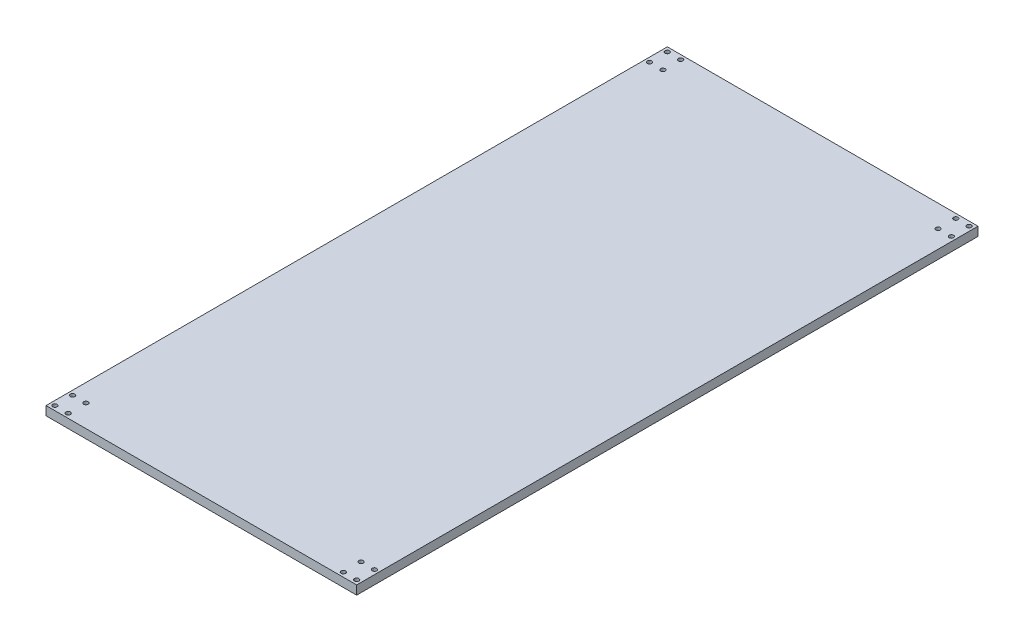
ISO-10303-21;
HEADER;
FILE_DESCRIPTION(('STEP AP214'),'2;1');
FILE_NAME('part.step','',(''),(''),'','','');
FILE_SCHEMA(('AUTOMOTIVE_DESIGN { 1 0 10303 214 1 1 1 1 }'));
ENDSEC;
DATA;
#1=APPLICATION_CONTEXT('core data for automotive mechanical design processes');
#2=APPLICATION_PROTOCOL_DEFINITION('international standard','automotive_design',2000,#1);
#3=PRODUCT_CONTEXT('',#1,'mechanical');
#4=PRODUCT('Part','Part','',(#3));
#5=PRODUCT_RELATED_PRODUCT_CATEGORY('part','',(#4));
#6=PRODUCT_DEFINITION_FORMATION('','',#4);
#7=PRODUCT_DEFINITION_CONTEXT('part definition',#1,'design');
#8=PRODUCT_DEFINITION('design','',#6,#7);
#9=PRODUCT_DEFINITION_SHAPE('','',#8);
#10=(LENGTH_UNIT() NAMED_UNIT(*) SI_UNIT(.MILLI.,.METRE.));
#11=(NAMED_UNIT(*) PLANE_ANGLE_UNIT() SI_UNIT($,.RADIAN.));
#12=(NAMED_UNIT(*) SI_UNIT($,.STERADIAN.) SOLID_ANGLE_UNIT());
#13=UNCERTAINTY_MEASURE_WITH_UNIT(LENGTH_MEASURE(1.E-05),#10,'distance_accuracy_value','');
#14=(GEOMETRIC_REPRESENTATION_CONTEXT(3) GLOBAL_UNCERTAINTY_ASSIGNED_CONTEXT((#13)) GLOBAL_UNIT_ASSIGNED_CONTEXT((#10,
#11,#12)) REPRESENTATION_CONTEXT('',''));
#15=CARTESIAN_POINT('',(0.,0.,0.));
#16=DIRECTION('',(0.,0.,1.));
#17=DIRECTION('',(1.,0.,0.));
#18=AXIS2_PLACEMENT_3D('',#15,#16,#17);
#19=CARTESIAN_POINT('',(0.,10.,0.));
#20=DIRECTION('',(0.,-1.,0.));
#21=DIRECTION('',(0.,0.,-1.));
#22=AXIS2_PLACEMENT_3D('',#19,#20,#21);
#23=PLANE('',#22);
#24=DIRECTION('',(0.,0.,-1.));
#25=VECTOR('',#24,1.);
#26=CARTESIAN_POINT('',(175.,10.,350.));
#27=LINE('',#26,#25);
#28=CARTESIAN_POINT('',(175.,10.,350.));
#29=VERTEX_POINT('',#28);
#30=CARTESIAN_POINT('',(175.,10.,-350.));
#31=VERTEX_POINT('',#30);
#32=EDGE_CURVE('E87',#29,#31,#27,.T.);
#33=ORIENTED_EDGE('',*,*,#32,.T.);
#34=DIRECTION('',(-1.,0.,0.));
#35=VECTOR('',#34,1.);
#36=CARTESIAN_POINT('',(-175.,10.,-350.));
#37=LINE('',#36,#35);
#38=CARTESIAN_POINT('',(-175.,10.,-350.));
#39=VERTEX_POINT('',#38);
#40=EDGE_CURVE('E82',#31,#39,#37,.T.);
#41=ORIENTED_EDGE('',*,*,#40,.T.);
#42=DIRECTION('',(0.,0.,1.));
#43=VECTOR('',#42,1.);
#44=CARTESIAN_POINT('',(-175.,10.,350.));
#45=LINE('',#44,#43);
#46=CARTESIAN_POINT('',(-175.,10.,350.));
#47=VERTEX_POINT('',#46);
#48=EDGE_CURVE('E85',#39,#47,#45,.T.);
#49=ORIENTED_EDGE('',*,*,#48,.T.);
#50=DIRECTION('',(1.,0.,0.));
#51=VECTOR('',#50,1.);
#52=CARTESIAN_POINT('',(-175.,10.,350.));
#53=LINE('',#52,#51);
#54=EDGE_CURVE('E52',#47,#29,#53,.T.);
#55=ORIENTED_EDGE('',*,*,#54,.T.);
#56=EDGE_LOOP('',(#33,#41,#49,#55));
#57=FACE_BOUND('',#56,.T.);
#58=CARTESIAN_POINT('',(170.,10.,-345.));
#59=DIRECTION('',(0.,1.,0.));
#60=DIRECTION('',(0.,0.,1.));
#61=AXIS2_PLACEMENT_3D('',#58,#59,#60);
#62=CIRCLE('',#61,2.5);
#63=CARTESIAN_POINT('',(170.,10.,-342.5));
#64=VERTEX_POINT('',#63);
#65=EDGE_CURVE('E102',#64,#64,#62,.T.);
#66=ORIENTED_EDGE('',*,*,#65,.F.);
#67=EDGE_LOOP('',(#66));
#68=FACE_BOUND('',#67,.T.);
#69=CARTESIAN_POINT('',(-170.,10.,-325.));
#70=DIRECTION('',(0.,1.,0.));
#71=DIRECTION('',(0.,0.,-1.));
#72=AXIS2_PLACEMENT_3D('',#69,#70,#71);
#73=CIRCLE('',#72,2.5);
#74=CARTESIAN_POINT('',(-170.,10.,-327.5));
#75=VERTEX_POINT('',#74);
#76=EDGE_CURVE('E117',#75,#75,#73,.T.);
#77=ORIENTED_EDGE('',*,*,#76,.F.);
#78=EDGE_LOOP('',(#77));
#79=FACE_BOUND('',#78,.T.);
#80=CARTESIAN_POINT('',(155.,10.,-345.));
#81=DIRECTION('',(0.,1.,0.));
#82=DIRECTION('',(0.,0.,1.));
#83=AXIS2_PLACEMENT_3D('',#80,#81,#82);
#84=CIRCLE('',#83,2.49999999999997);
#85=CARTESIAN_POINT('',(155.,10.,-342.5));
#86=VERTEX_POINT('',#85);
#87=EDGE_CURVE('E123',#86,#86,#84,.T.);
#88=ORIENTED_EDGE('',*,*,#87,.F.);
#89=EDGE_LOOP('',(#88));
#90=FACE_BOUND('',#89,.T.);
#91=CARTESIAN_POINT('',(155.,10.,-325.));
#92=DIRECTION('',(0.,1.,0.));
#93=DIRECTION('',(0.,0.,1.));
#94=AXIS2_PLACEMENT_3D('',#91,#92,#93);
#95=CIRCLE('',#94,2.5);
#96=CARTESIAN_POINT('',(155.,10.,-322.5));
#97=VERTEX_POINT('',#96);
#98=EDGE_CURVE('E129',#97,#97,#95,.T.);
#99=ORIENTED_EDGE('',*,*,#98,.F.);
#100=EDGE_LOOP('',(#99));
#101=FACE_BOUND('',#100,.T.);
#102=CARTESIAN_POINT('',(170.,10.,-325.));
#103=DIRECTION('',(0.,1.,0.));
#104=DIRECTION('',(0.,0.,1.));
#105=AXIS2_PLACEMENT_3D('',#102,#103,#104);
#106=CIRCLE('',#105,2.5);
#107=CARTESIAN_POINT('',(170.,10.,-322.5));
#108=VERTEX_POINT('',#107);
#109=EDGE_CURVE('E135',#108,#108,#106,.T.);
#110=ORIENTED_EDGE('',*,*,#109,.F.);
#111=EDGE_LOOP('',(#110));
#112=FACE_BOUND('',#111,.T.);
#113=CARTESIAN_POINT('',(-155.,10.,-325.));
#114=DIRECTION('',(0.,1.,0.));
#115=DIRECTION('',(0.,0.,-1.));
#116=AXIS2_PLACEMENT_3D('',#113,#114,#115);
#117=CIRCLE('',#116,2.5);
#118=CARTESIAN_POINT('',(-155.,10.,-327.5));
#119=VERTEX_POINT('',#118);
#120=EDGE_CURVE('E141',#119,#119,#117,.T.);
#121=ORIENTED_EDGE('',*,*,#120,.F.);
#122=EDGE_LOOP('',(#121));
#123=FACE_BOUND('',#122,.T.);
#124=CARTESIAN_POINT('',(-155.,10.,-345.));
#125=DIRECTION('',(0.,1.,0.));
#126=DIRECTION('',(0.,0.,-1.));
#127=AXIS2_PLACEMENT_3D('',#124,#125,#126);
#128=CIRCLE('',#127,2.49999999999997);
#129=CARTESIAN_POINT('',(-155.,10.,-347.5));
#130=VERTEX_POINT('',#129);
#131=EDGE_CURVE('E147',#130,#130,#128,.T.);
#132=ORIENTED_EDGE('',*,*,#131,.F.);
#133=EDGE_LOOP('',(#132));
#134=FACE_BOUND('',#133,.T.);
#135=CARTESIAN_POINT('',(-170.,10.,-345.));
#136=DIRECTION('',(0.,1.,0.));
#137=DIRECTION('',(0.,0.,-1.));
#138=AXIS2_PLACEMENT_3D('',#135,#136,#137);
#139=CIRCLE('',#138,2.5);
#140=CARTESIAN_POINT('',(-170.,10.,-347.5));
#141=VERTEX_POINT('',#140);
#142=EDGE_CURVE('E153',#141,#141,#139,.T.);
#143=ORIENTED_EDGE('',*,*,#142,.F.);
#144=EDGE_LOOP('',(#143));
#145=FACE_BOUND('',#144,.T.);
#146=CARTESIAN_POINT('',(-170.,10.,345.));
#147=DIRECTION('',(0.,1.,0.));
#148=DIRECTION('',(0.,0.,1.));
#149=AXIS2_PLACEMENT_3D('',#146,#147,#148);
#150=CIRCLE('',#149,2.5);
#151=CARTESIAN_POINT('',(-170.,10.,347.5));
#152=VERTEX_POINT('',#151);
#153=EDGE_CURVE('E159',#152,#152,#150,.T.);
#154=ORIENTED_EDGE('',*,*,#153,.F.);
#155=EDGE_LOOP('',(#154));
#156=FACE_BOUND('',#155,.T.);
#157=CARTESIAN_POINT('',(-155.,10.,345.));
#158=DIRECTION('',(0.,1.,0.));
#159=DIRECTION('',(0.,0.,1.));
#160=AXIS2_PLACEMENT_3D('',#157,#158,#159);
#161=CIRCLE('',#160,2.49999999999997);
#162=CARTESIAN_POINT('',(-155.,10.,347.5));
#163=VERTEX_POINT('',#162);
#164=EDGE_CURVE('E165',#163,#163,#161,.T.);
#165=ORIENTED_EDGE('',*,*,#164,.F.);
#166=EDGE_LOOP('',(#165));
#167=FACE_BOUND('',#166,.T.);
#168=CARTESIAN_POINT('',(-155.,10.,325.));
#169=DIRECTION('',(0.,1.,0.));
#170=DIRECTION('',(0.,0.,1.));
#171=AXIS2_PLACEMENT_3D('',#168,#169,#170);
#172=CIRCLE('',#171,2.49999999999997);
#173=CARTESIAN_POINT('',(-155.,10.,327.5));
#174=VERTEX_POINT('',#173);
#175=EDGE_CURVE('E171',#174,#174,#172,.T.);
#176=ORIENTED_EDGE('',*,*,#175,.F.);
#177=EDGE_LOOP('',(#176));
#178=FACE_BOUND('',#177,.T.);
#179=CARTESIAN_POINT('',(-170.,10.,325.));
#180=DIRECTION('',(0.,1.,0.));
#181=DIRECTION('',(0.,0.,1.));
#182=AXIS2_PLACEMENT_3D('',#179,#180,#181);
#183=CIRCLE('',#182,2.5);
#184=CARTESIAN_POINT('',(-170.,10.,327.5));
#185=VERTEX_POINT('',#184);
#186=EDGE_CURVE('E177',#185,#185,#183,.T.);
#187=ORIENTED_EDGE('',*,*,#186,.F.);
#188=EDGE_LOOP('',(#187));
#189=FACE_BOUND('',#188,.T.);
#190=CARTESIAN_POINT('',(170.,10.,325.));
#191=DIRECTION('',(0.,1.,0.));
#192=DIRECTION('',(0.,0.,-1.));
#193=AXIS2_PLACEMENT_3D('',#190,#191,#192);
#194=CIRCLE('',#193,2.5);
#195=CARTESIAN_POINT('',(170.,10.,322.5));
#196=VERTEX_POINT('',#195);
#197=EDGE_CURVE('E183',#196,#196,#194,.T.);
#198=ORIENTED_EDGE('',*,*,#197,.F.);
#199=EDGE_LOOP('',(#198));
#200=FACE_BOUND('',#199,.T.);
#201=CARTESIAN_POINT('',(155.,10.,325.));
#202=DIRECTION('',(0.,1.,0.));
#203=DIRECTION('',(0.,0.,-1.));
#204=AXIS2_PLACEMENT_3D('',#201,#202,#203);
#205=CIRCLE('',#204,2.5);
#206=CARTESIAN_POINT('',(155.,10.,322.5));
#207=VERTEX_POINT('',#206);
#208=EDGE_CURVE('E189',#207,#207,#205,.T.);
#209=ORIENTED_EDGE('',*,*,#208,.F.);
#210=EDGE_LOOP('',(#209));
#211=FACE_BOUND('',#210,.T.);
#212=CARTESIAN_POINT('',(155.,10.,345.));
#213=DIRECTION('',(0.,1.,0.));
#214=DIRECTION('',(0.,0.,-1.));
#215=AXIS2_PLACEMENT_3D('',#212,#213,#214);
#216=CIRCLE('',#215,2.49999999999997);
#217=CARTESIAN_POINT('',(155.,10.,342.5));
#218=VERTEX_POINT('',#217);
#219=EDGE_CURVE('E195',#218,#218,#216,.T.);
#220=ORIENTED_EDGE('',*,*,#219,.F.);
#221=EDGE_LOOP('',(#220));
#222=FACE_BOUND('',#221,.T.);
#223=CARTESIAN_POINT('',(170.,10.,345.));
#224=DIRECTION('',(0.,1.,0.));
#225=DIRECTION('',(0.,0.,-1.));
#226=AXIS2_PLACEMENT_3D('',#223,#224,#225);
#227=CIRCLE('',#226,2.5);
#228=CARTESIAN_POINT('',(170.,10.,342.5));
#229=VERTEX_POINT('',#228);
#230=EDGE_CURVE('E201',#229,#229,#227,.T.);
#231=ORIENTED_EDGE('',*,*,#230,.F.);
#232=EDGE_LOOP('',(#231));
#233=FACE_BOUND('',#232,.T.);
#234=ADVANCED_FACE('F35',(#57,#68,#79,#90,#101,#112,#123,#134,#145,#156,#167,#178,#189,#200,
#211,#222,#233),#23,.F.);
#235=CARTESIAN_POINT('',(0.,0.,0.));
#236=DIRECTION('',(0.,-1.,0.));
#237=DIRECTION('',(0.,0.,-1.));
#238=AXIS2_PLACEMENT_3D('',#235,#236,#237);
#239=PLANE('',#238);
#240=CARTESIAN_POINT('',(155.,0.,345.));
#241=DIRECTION('',(0.,1.,0.));
#242=DIRECTION('',(0.,0.,-1.));
#243=AXIS2_PLACEMENT_3D('',#240,#241,#242);
#244=CIRCLE('',#243,2.49999999999997);
#245=CARTESIAN_POINT('',(155.,0.,342.5));
#246=VERTEX_POINT('',#245);
#247=EDGE_CURVE('E198',#246,#246,#244,.T.);
#248=ORIENTED_EDGE('',*,*,#247,.T.);
#249=EDGE_LOOP('',(#248));
#250=FACE_BOUND('',#249,.T.);
#251=CARTESIAN_POINT('',(170.,0.,325.));
#252=DIRECTION('',(0.,1.,0.));
#253=DIRECTION('',(0.,0.,-1.));
#254=AXIS2_PLACEMENT_3D('',#251,#252,#253);
#255=CIRCLE('',#254,2.5);
#256=CARTESIAN_POINT('',(170.,0.,322.5));
#257=VERTEX_POINT('',#256);
#258=EDGE_CURVE('E186',#257,#257,#255,.T.);
#259=ORIENTED_EDGE('',*,*,#258,.T.);
#260=EDGE_LOOP('',(#259));
#261=FACE_BOUND('',#260,.T.);
#262=CARTESIAN_POINT('',(-155.,0.,325.));
#263=DIRECTION('',(0.,1.,0.));
#264=DIRECTION('',(0.,0.,1.));
#265=AXIS2_PLACEMENT_3D('',#262,#263,#264);
#266=CIRCLE('',#265,2.49999999999997);
#267=CARTESIAN_POINT('',(-155.,0.,327.5));
#268=VERTEX_POINT('',#267);
#269=EDGE_CURVE('E174',#268,#268,#266,.T.);
#270=ORIENTED_EDGE('',*,*,#269,.T.);
#271=EDGE_LOOP('',(#270));
#272=FACE_BOUND('',#271,.T.);
#273=CARTESIAN_POINT('',(-170.,0.,345.));
#274=DIRECTION('',(0.,1.,0.));
#275=DIRECTION('',(0.,0.,1.));
#276=AXIS2_PLACEMENT_3D('',#273,#274,#275);
#277=CIRCLE('',#276,2.5);
#278=CARTESIAN_POINT('',(-170.,0.,347.5));
#279=VERTEX_POINT('',#278);
#280=EDGE_CURVE('E162',#279,#279,#277,.T.);
#281=ORIENTED_EDGE('',*,*,#280,.T.);
#282=EDGE_LOOP('',(#281));
#283=FACE_BOUND('',#282,.T.);
#284=CARTESIAN_POINT('',(-155.,0.,-345.));
#285=DIRECTION('',(0.,1.,0.));
#286=DIRECTION('',(0.,0.,-1.));
#287=AXIS2_PLACEMENT_3D('',#284,#285,#286);
#288=CIRCLE('',#287,2.49999999999997);
#289=CARTESIAN_POINT('',(-155.,0.,-347.5));
#290=VERTEX_POINT('',#289);
#291=EDGE_CURVE('E150',#290,#290,#288,.T.);
#292=ORIENTED_EDGE('',*,*,#291,.T.);
#293=EDGE_LOOP('',(#292));
#294=FACE_BOUND('',#293,.T.);
#295=CARTESIAN_POINT('',(170.,0.,-325.));
#296=DIRECTION('',(0.,1.,0.));
#297=DIRECTION('',(0.,0.,1.));
#298=AXIS2_PLACEMENT_3D('',#295,#296,#297);
#299=CIRCLE('',#298,2.5);
#300=CARTESIAN_POINT('',(170.,0.,-322.5));
#301=VERTEX_POINT('',#300);
#302=EDGE_CURVE('E138',#301,#301,#299,.T.);
#303=ORIENTED_EDGE('',*,*,#302,.T.);
#304=EDGE_LOOP('',(#303));
#305=FACE_BOUND('',#304,.T.);
#306=CARTESIAN_POINT('',(155.,0.,-345.));
#307=DIRECTION('',(0.,1.,0.));
#308=DIRECTION('',(0.,0.,1.));
#309=AXIS2_PLACEMENT_3D('',#306,#307,#308);
#310=CIRCLE('',#309,2.49999999999997);
#311=CARTESIAN_POINT('',(155.,0.,-342.5));
#312=VERTEX_POINT('',#311);
#313=EDGE_CURVE('E126',#312,#312,#310,.T.);
#314=ORIENTED_EDGE('',*,*,#313,.T.);
#315=EDGE_LOOP('',(#314));
#316=FACE_BOUND('',#315,.T.);
#317=CARTESIAN_POINT('',(170.,0.,-345.));
#318=DIRECTION('',(0.,1.,0.));
#319=DIRECTION('',(0.,0.,1.));
#320=AXIS2_PLACEMENT_3D('',#317,#318,#319);
#321=CIRCLE('',#320,2.5);
#322=CARTESIAN_POINT('',(170.,0.,-342.5));
#323=VERTEX_POINT('',#322);
#324=EDGE_CURVE('E114',#323,#323,#321,.T.);
#325=ORIENTED_EDGE('',*,*,#324,.T.);
#326=EDGE_LOOP('',(#325));
#327=FACE_BOUND('',#326,.T.);
#328=DIRECTION('',(0.,0.,-1.));
#329=VECTOR('',#328,1.);
#330=CARTESIAN_POINT('',(175.,0.,350.));
#331=LINE('',#330,#329);
#332=CARTESIAN_POINT('',(175.,0.,350.));
#333=VERTEX_POINT('',#332);
#334=CARTESIAN_POINT('',(175.,0.,-350.));
#335=VERTEX_POINT('',#334);
#336=EDGE_CURVE('E99',#333,#335,#331,.T.);
#337=ORIENTED_EDGE('',*,*,#336,.F.);
#338=DIRECTION('',(1.,0.,0.));
#339=VECTOR('',#338,1.);
#340=CARTESIAN_POINT('',(-175.,0.,350.));
#341=LINE('',#340,#339);
#342=CARTESIAN_POINT('',(-175.,0.,350.));
#343=VERTEX_POINT('',#342);
#344=EDGE_CURVE('E75',#343,#333,#341,.T.);
#345=ORIENTED_EDGE('',*,*,#344,.F.);
#346=DIRECTION('',(0.,0.,1.));
#347=VECTOR('',#346,1.);
#348=CARTESIAN_POINT('',(-175.,0.,350.));
#349=LINE('',#348,#347);
#350=CARTESIAN_POINT('',(-175.,0.,-350.));
#351=VERTEX_POINT('',#350);
#352=EDGE_CURVE('E69',#351,#343,#349,.T.);
#353=ORIENTED_EDGE('',*,*,#352,.F.);
#354=DIRECTION('',(-1.,0.,0.));
#355=VECTOR('',#354,1.);
#356=CARTESIAN_POINT('',(-175.,0.,-350.));
#357=LINE('',#356,#355);
#358=EDGE_CURVE('E91',#335,#351,#357,.T.);
#359=ORIENTED_EDGE('',*,*,#358,.F.);
#360=EDGE_LOOP('',(#337,#345,#353,#359));
#361=FACE_BOUND('',#360,.T.);
#362=CARTESIAN_POINT('',(-170.,0.,-325.));
#363=DIRECTION('',(0.,1.,0.));
#364=DIRECTION('',(0.,0.,-1.));
#365=AXIS2_PLACEMENT_3D('',#362,#363,#364);
#366=CIRCLE('',#365,2.5);
#367=CARTESIAN_POINT('',(-170.,0.,-327.5));
#368=VERTEX_POINT('',#367);
#369=EDGE_CURVE('E120',#368,#368,#366,.T.);
#370=ORIENTED_EDGE('',*,*,#369,.T.);
#371=EDGE_LOOP('',(#370));
#372=FACE_BOUND('',#371,.T.);
#373=CARTESIAN_POINT('',(155.,0.,-325.));
#374=DIRECTION('',(0.,1.,0.));
#375=DIRECTION('',(0.,0.,1.));
#376=AXIS2_PLACEMENT_3D('',#373,#374,#375);
#377=CIRCLE('',#376,2.5);
#378=CARTESIAN_POINT('',(155.,0.,-322.5));
#379=VERTEX_POINT('',#378);
#380=EDGE_CURVE('E132',#379,#379,#377,.T.);
#381=ORIENTED_EDGE('',*,*,#380,.T.);
#382=EDGE_LOOP('',(#381));
#383=FACE_BOUND('',#382,.T.);
#384=CARTESIAN_POINT('',(-155.,0.,-325.));
#385=DIRECTION('',(0.,1.,0.));
#386=DIRECTION('',(0.,0.,-1.));
#387=AXIS2_PLACEMENT_3D('',#384,#385,#386);
#388=CIRCLE('',#387,2.5);
#389=CARTESIAN_POINT('',(-155.,0.,-327.5));
#390=VERTEX_POINT('',#389);
#391=EDGE_CURVE('E144',#390,#390,#388,.T.);
#392=ORIENTED_EDGE('',*,*,#391,.T.);
#393=EDGE_LOOP('',(#392));
#394=FACE_BOUND('',#393,.T.);
#395=CARTESIAN_POINT('',(-170.,0.,-345.));
#396=DIRECTION('',(0.,1.,0.));
#397=DIRECTION('',(0.,0.,-1.));
#398=AXIS2_PLACEMENT_3D('',#395,#396,#397);
#399=CIRCLE('',#398,2.5);
#400=CARTESIAN_POINT('',(-170.,0.,-347.5));
#401=VERTEX_POINT('',#400);
#402=EDGE_CURVE('E156',#401,#401,#399,.T.);
#403=ORIENTED_EDGE('',*,*,#402,.T.);
#404=EDGE_LOOP('',(#403));
#405=FACE_BOUND('',#404,.T.);
#406=CARTESIAN_POINT('',(-155.,0.,345.));
#407=DIRECTION('',(0.,1.,0.));
#408=DIRECTION('',(0.,0.,1.));
#409=AXIS2_PLACEMENT_3D('',#406,#407,#408);
#410=CIRCLE('',#409,2.49999999999997);
#411=CARTESIAN_POINT('',(-155.,0.,347.5));
#412=VERTEX_POINT('',#411);
#413=EDGE_CURVE('E168',#412,#412,#410,.T.);
#414=ORIENTED_EDGE('',*,*,#413,.T.);
#415=EDGE_LOOP('',(#414));
#416=FACE_BOUND('',#415,.T.);
#417=CARTESIAN_POINT('',(-170.,0.,325.));
#418=DIRECTION('',(0.,1.,0.));
#419=DIRECTION('',(0.,0.,1.));
#420=AXIS2_PLACEMENT_3D('',#417,#418,#419);
#421=CIRCLE('',#420,2.5);
#422=CARTESIAN_POINT('',(-170.,0.,327.5));
#423=VERTEX_POINT('',#422);
#424=EDGE_CURVE('E180',#423,#423,#421,.T.);
#425=ORIENTED_EDGE('',*,*,#424,.T.);
#426=EDGE_LOOP('',(#425));
#427=FACE_BOUND('',#426,.T.);
#428=CARTESIAN_POINT('',(155.,0.,325.));
#429=DIRECTION('',(0.,1.,0.));
#430=DIRECTION('',(0.,0.,-1.));
#431=AXIS2_PLACEMENT_3D('',#428,#429,#430);
#432=CIRCLE('',#431,2.5);
#433=CARTESIAN_POINT('',(155.,0.,322.5));
#434=VERTEX_POINT('',#433);
#435=EDGE_CURVE('E192',#434,#434,#432,.T.);
#436=ORIENTED_EDGE('',*,*,#435,.T.);
#437=EDGE_LOOP('',(#436));
#438=FACE_BOUND('',#437,.T.);
#439=CARTESIAN_POINT('',(170.,0.,345.));
#440=DIRECTION('',(0.,1.,0.));
#441=DIRECTION('',(0.,0.,-1.));
#442=AXIS2_PLACEMENT_3D('',#439,#440,#441);
#443=CIRCLE('',#442,2.5);
#444=CARTESIAN_POINT('',(170.,0.,342.5));
#445=VERTEX_POINT('',#444);
#446=EDGE_CURVE('E204',#445,#445,#443,.T.);
#447=ORIENTED_EDGE('',*,*,#446,.T.);
#448=EDGE_LOOP('',(#447));
#449=FACE_BOUND('',#448,.T.);
#450=ADVANCED_FACE('F110',(#250,#261,#272,#283,#294,#305,#316,#327,#361,#372,#383,#394,#405,
#416,#427,#438,#449),#239,.T.);
#451=CARTESIAN_POINT('',(175.,10.,350.));
#452=DIRECTION('',(-1.,0.,0.));
#453=DIRECTION('',(0.,0.,1.));
#454=AXIS2_PLACEMENT_3D('',#451,#452,#453);
#455=PLANE('',#454);
#456=ORIENTED_EDGE('',*,*,#336,.T.);
#457=DIRECTION('',(0.,-1.,0.));
#458=VECTOR('',#457,1.);
#459=CARTESIAN_POINT('',(175.,10.,-350.));
#460=LINE('',#459,#458);
#461=EDGE_CURVE('E11',#31,#335,#460,.T.);
#462=ORIENTED_EDGE('',*,*,#461,.F.);
#463=ORIENTED_EDGE('',*,*,#32,.F.);
#464=DIRECTION('',(0.,-1.,0.));
#465=VECTOR('',#464,1.);
#466=CARTESIAN_POINT('',(175.,10.,350.));
#467=LINE('',#466,#465);
#468=EDGE_CURVE('E95',#29,#333,#467,.T.);
#469=ORIENTED_EDGE('',*,*,#468,.T.);
#470=EDGE_LOOP('',(#456,#462,#463,#469));
#471=FACE_BOUND('',#470,.T.);
#472=ADVANCED_FACE('F37',(#471),#455,.F.);
#473=CARTESIAN_POINT('',(-175.,10.,-350.));
#474=DIRECTION('',(0.,0.,1.));
#475=DIRECTION('',(1.,0.,0.));
#476=AXIS2_PLACEMENT_3D('',#473,#474,#475);
#477=PLANE('',#476);
#478=ORIENTED_EDGE('',*,*,#358,.T.);
#479=DIRECTION('',(0.,-1.,0.));
#480=VECTOR('',#479,1.);
#481=CARTESIAN_POINT('',(-175.,10.,-350.));
#482=LINE('',#481,#480);
#483=EDGE_CURVE('E44',#39,#351,#482,.T.);
#484=ORIENTED_EDGE('',*,*,#483,.F.);
#485=ORIENTED_EDGE('',*,*,#40,.F.);
#486=ORIENTED_EDGE('',*,*,#461,.T.);
#487=EDGE_LOOP('',(#478,#484,#485,#486));
#488=FACE_BOUND('',#487,.T.);
#489=ADVANCED_FACE('F90',(#488),#477,.F.);
#490=CARTESIAN_POINT('',(-175.,10.,350.));
#491=DIRECTION('',(1.,0.,0.));
#492=DIRECTION('',(0.,0.,-1.));
#493=AXIS2_PLACEMENT_3D('',#490,#491,#492);
#494=PLANE('',#493);
#495=ORIENTED_EDGE('',*,*,#352,.T.);
#496=DIRECTION('',(0.,-1.,0.));
#497=VECTOR('',#496,1.);
#498=CARTESIAN_POINT('',(-175.,10.,350.));
#499=LINE('',#498,#497);
#500=EDGE_CURVE('E92',#47,#343,#499,.T.);
#501=ORIENTED_EDGE('',*,*,#500,.F.);
#502=ORIENTED_EDGE('',*,*,#48,.F.);
#503=ORIENTED_EDGE('',*,*,#483,.T.);
#504=EDGE_LOOP('',(#495,#501,#502,#503));
#505=FACE_BOUND('',#504,.T.);
#506=ADVANCED_FACE('F93',(#505),#494,.F.);
#507=CARTESIAN_POINT('',(-175.,10.,350.));
#508=DIRECTION('',(0.,0.,-1.));
#509=DIRECTION('',(-1.,0.,0.));
#510=AXIS2_PLACEMENT_3D('',#507,#508,#509);
#511=PLANE('',#510);
#512=ORIENTED_EDGE('',*,*,#344,.T.);
#513=ORIENTED_EDGE('',*,*,#468,.F.);
#514=ORIENTED_EDGE('',*,*,#54,.F.);
#515=ORIENTED_EDGE('',*,*,#500,.T.);
#516=EDGE_LOOP('',(#512,#513,#514,#515));
#517=FACE_BOUND('',#516,.T.);
#518=ADVANCED_FACE('F107',(#517),#511,.F.);
#519=CARTESIAN_POINT('',(170.,10.,-345.));
#520=DIRECTION('',(0.,-1.,0.));
#521=DIRECTION('',(0.,0.,-1.));
#522=AXIS2_PLACEMENT_3D('',#519,#520,#521);
#523=CYLINDRICAL_SURFACE('',#522,2.5);
#524=ORIENTED_EDGE('',*,*,#65,.T.);
#525=EDGE_LOOP('',(#524));
#526=FACE_BOUND('',#525,.T.);
#527=ORIENTED_EDGE('',*,*,#324,.F.);
#528=EDGE_LOOP('',(#527));
#529=FACE_BOUND('',#528,.T.);
#530=ADVANCED_FACE('F221',(#526,#529),#523,.F.);
#531=CARTESIAN_POINT('',(-170.,10.,-325.));
#532=DIRECTION('',(0.,-1.,0.));
#533=DIRECTION('',(0.,0.,-1.));
#534=AXIS2_PLACEMENT_3D('',#531,#532,#533);
#535=CYLINDRICAL_SURFACE('',#534,2.5);
#536=ORIENTED_EDGE('',*,*,#76,.T.);
#537=EDGE_LOOP('',(#536));
#538=FACE_BOUND('',#537,.T.);
#539=ORIENTED_EDGE('',*,*,#369,.F.);
#540=EDGE_LOOP('',(#539));
#541=FACE_BOUND('',#540,.T.);
#542=ADVANCED_FACE('F267',(#538,#541),#535,.F.);
#543=CARTESIAN_POINT('',(155.,10.,-345.));
#544=DIRECTION('',(0.,-1.,0.));
#545=DIRECTION('',(0.,0.,-1.));
#546=AXIS2_PLACEMENT_3D('',#543,#544,#545);
#547=CYLINDRICAL_SURFACE('',#546,2.49999999999997);
#548=ORIENTED_EDGE('',*,*,#87,.T.);
#549=EDGE_LOOP('',(#548));
#550=FACE_BOUND('',#549,.T.);
#551=ORIENTED_EDGE('',*,*,#313,.F.);
#552=EDGE_LOOP('',(#551));
#553=FACE_BOUND('',#552,.T.);
#554=ADVANCED_FACE('F275',(#550,#553),#547,.F.);
#555=CARTESIAN_POINT('',(155.,10.,-325.));
#556=DIRECTION('',(0.,-1.,0.));
#557=DIRECTION('',(0.,0.,-1.));
#558=AXIS2_PLACEMENT_3D('',#555,#556,#557);
#559=CYLINDRICAL_SURFACE('',#558,2.5);
#560=ORIENTED_EDGE('',*,*,#98,.T.);
#561=EDGE_LOOP('',(#560));
#562=FACE_BOUND('',#561,.T.);
#563=ORIENTED_EDGE('',*,*,#380,.F.);
#564=EDGE_LOOP('',(#563));
#565=FACE_BOUND('',#564,.T.);
#566=ADVANCED_FACE('F283',(#562,#565),#559,.F.);
#567=CARTESIAN_POINT('',(170.,10.,-325.));
#568=DIRECTION('',(0.,-1.,0.));
#569=DIRECTION('',(0.,0.,-1.));
#570=AXIS2_PLACEMENT_3D('',#567,#568,#569);
#571=CYLINDRICAL_SURFACE('',#570,2.5);
#572=ORIENTED_EDGE('',*,*,#109,.T.);
#573=EDGE_LOOP('',(#572));
#574=FACE_BOUND('',#573,.T.);
#575=ORIENTED_EDGE('',*,*,#302,.F.);
#576=EDGE_LOOP('',(#575));
#577=FACE_BOUND('',#576,.T.);
#578=ADVANCED_FACE('F292',(#574,#577),#571,.F.);
#579=CARTESIAN_POINT('',(-155.,10.,-325.));
#580=DIRECTION('',(0.,-1.,0.));
#581=DIRECTION('',(0.,0.,-1.));
#582=AXIS2_PLACEMENT_3D('',#579,#580,#581);
#583=CYLINDRICAL_SURFACE('',#582,2.5);
#584=ORIENTED_EDGE('',*,*,#120,.T.);
#585=EDGE_LOOP('',(#584));
#586=FACE_BOUND('',#585,.T.);
#587=ORIENTED_EDGE('',*,*,#391,.F.);
#588=EDGE_LOOP('',(#587));
#589=FACE_BOUND('',#588,.T.);
#590=ADVANCED_FACE('F301',(#586,#589),#583,.F.);
#591=CARTESIAN_POINT('',(-155.,10.,-345.));
#592=DIRECTION('',(0.,-1.,0.));
#593=DIRECTION('',(0.,0.,-1.));
#594=AXIS2_PLACEMENT_3D('',#591,#592,#593);
#595=CYLINDRICAL_SURFACE('',#594,2.49999999999997);
#596=ORIENTED_EDGE('',*,*,#131,.T.);
#597=EDGE_LOOP('',(#596));
#598=FACE_BOUND('',#597,.T.);
#599=ORIENTED_EDGE('',*,*,#291,.F.);
#600=EDGE_LOOP('',(#599));
#601=FACE_BOUND('',#600,.T.);
#602=ADVANCED_FACE('F310',(#598,#601),#595,.F.);
#603=CARTESIAN_POINT('',(-170.,10.,-345.));
#604=DIRECTION('',(0.,-1.,0.));
#605=DIRECTION('',(0.,0.,-1.));
#606=AXIS2_PLACEMENT_3D('',#603,#604,#605);
#607=CYLINDRICAL_SURFACE('',#606,2.5);
#608=ORIENTED_EDGE('',*,*,#142,.T.);
#609=EDGE_LOOP('',(#608));
#610=FACE_BOUND('',#609,.T.);
#611=ORIENTED_EDGE('',*,*,#402,.F.);
#612=EDGE_LOOP('',(#611));
#613=FACE_BOUND('',#612,.T.);
#614=ADVANCED_FACE('F319',(#610,#613),#607,.F.);
#615=CARTESIAN_POINT('',(-170.,10.,345.));
#616=DIRECTION('',(0.,-1.,0.));
#617=DIRECTION('',(0.,0.,-1.));
#618=AXIS2_PLACEMENT_3D('',#615,#616,#617);
#619=CYLINDRICAL_SURFACE('',#618,2.5);
#620=ORIENTED_EDGE('',*,*,#153,.T.);
#621=EDGE_LOOP('',(#620));
#622=FACE_BOUND('',#621,.T.);
#623=ORIENTED_EDGE('',*,*,#280,.F.);
#624=EDGE_LOOP('',(#623));
#625=FACE_BOUND('',#624,.T.);
#626=ADVANCED_FACE('F328',(#622,#625),#619,.F.);
#627=CARTESIAN_POINT('',(-155.,10.,345.));
#628=DIRECTION('',(0.,-1.,0.));
#629=DIRECTION('',(0.,0.,-1.));
#630=AXIS2_PLACEMENT_3D('',#627,#628,#629);
#631=CYLINDRICAL_SURFACE('',#630,2.49999999999997);
#632=ORIENTED_EDGE('',*,*,#164,.T.);
#633=EDGE_LOOP('',(#632));
#634=FACE_BOUND('',#633,.T.);
#635=ORIENTED_EDGE('',*,*,#413,.F.);
#636=EDGE_LOOP('',(#635));
#637=FACE_BOUND('',#636,.T.);
#638=ADVANCED_FACE('F337',(#634,#637),#631,.F.);
#639=CARTESIAN_POINT('',(-155.,10.,325.));
#640=DIRECTION('',(0.,-1.,0.));
#641=DIRECTION('',(0.,0.,-1.));
#642=AXIS2_PLACEMENT_3D('',#639,#640,#641);
#643=CYLINDRICAL_SURFACE('',#642,2.49999999999997);
#644=ORIENTED_EDGE('',*,*,#175,.T.);
#645=EDGE_LOOP('',(#644));
#646=FACE_BOUND('',#645,.T.);
#647=ORIENTED_EDGE('',*,*,#269,.F.);
#648=EDGE_LOOP('',(#647));
#649=FACE_BOUND('',#648,.T.);
#650=ADVANCED_FACE('F346',(#646,#649),#643,.F.);
#651=CARTESIAN_POINT('',(-170.,10.,325.));
#652=DIRECTION('',(0.,-1.,0.));
#653=DIRECTION('',(0.,0.,-1.));
#654=AXIS2_PLACEMENT_3D('',#651,#652,#653);
#655=CYLINDRICAL_SURFACE('',#654,2.5);
#656=ORIENTED_EDGE('',*,*,#186,.T.);
#657=EDGE_LOOP('',(#656));
#658=FACE_BOUND('',#657,.T.);
#659=ORIENTED_EDGE('',*,*,#424,.F.);
#660=EDGE_LOOP('',(#659));
#661=FACE_BOUND('',#660,.T.);
#662=ADVANCED_FACE('F355',(#658,#661),#655,.F.);
#663=CARTESIAN_POINT('',(170.,10.,325.));
#664=DIRECTION('',(0.,-1.,0.));
#665=DIRECTION('',(0.,0.,-1.));
#666=AXIS2_PLACEMENT_3D('',#663,#664,#665);
#667=CYLINDRICAL_SURFACE('',#666,2.5);
#668=ORIENTED_EDGE('',*,*,#197,.T.);
#669=EDGE_LOOP('',(#668));
#670=FACE_BOUND('',#669,.T.);
#671=ORIENTED_EDGE('',*,*,#258,.F.);
#672=EDGE_LOOP('',(#671));
#673=FACE_BOUND('',#672,.T.);
#674=ADVANCED_FACE('F364',(#670,#673),#667,.F.);
#675=CARTESIAN_POINT('',(155.,10.,325.));
#676=DIRECTION('',(0.,-1.,0.));
#677=DIRECTION('',(0.,0.,-1.));
#678=AXIS2_PLACEMENT_3D('',#675,#676,#677);
#679=CYLINDRICAL_SURFACE('',#678,2.5);
#680=ORIENTED_EDGE('',*,*,#208,.T.);
#681=EDGE_LOOP('',(#680));
#682=FACE_BOUND('',#681,.T.);
#683=ORIENTED_EDGE('',*,*,#435,.F.);
#684=EDGE_LOOP('',(#683));
#685=FACE_BOUND('',#684,.T.);
#686=ADVANCED_FACE('F373',(#682,#685),#679,.F.);
#687=CARTESIAN_POINT('',(155.,10.,345.));
#688=DIRECTION('',(0.,-1.,0.));
#689=DIRECTION('',(0.,0.,-1.));
#690=AXIS2_PLACEMENT_3D('',#687,#688,#689);
#691=CYLINDRICAL_SURFACE('',#690,2.49999999999997);
#692=ORIENTED_EDGE('',*,*,#219,.T.);
#693=EDGE_LOOP('',(#692));
#694=FACE_BOUND('',#693,.T.);
#695=ORIENTED_EDGE('',*,*,#247,.F.);
#696=EDGE_LOOP('',(#695));
#697=FACE_BOUND('',#696,.T.);
#698=ADVANCED_FACE('F382',(#694,#697),#691,.F.);
#699=CARTESIAN_POINT('',(170.,10.,345.));
#700=DIRECTION('',(0.,-1.,0.));
#701=DIRECTION('',(0.,0.,-1.));
#702=AXIS2_PLACEMENT_3D('',#699,#700,#701);
#703=CYLINDRICAL_SURFACE('',#702,2.5);
#704=ORIENTED_EDGE('',*,*,#230,.T.);
#705=EDGE_LOOP('',(#704));
#706=FACE_BOUND('',#705,.T.);
#707=ORIENTED_EDGE('',*,*,#446,.F.);
#708=EDGE_LOOP('',(#707));
#709=FACE_BOUND('',#708,.T.);
#710=ADVANCED_FACE('F210',(#706,#709),#703,.F.);
#711=CLOSED_SHELL('',(#234,#450,#472,#489,#506,#518,#530,#542,#554,#566,#578,#590,#602,#614,
#626,#638,#650,#662,#674,#686,#698,#710));
#712=MANIFOLD_SOLID_BREP('B2',#711);
#713=ADVANCED_BREP_SHAPE_REPRESENTATION('',(#18,#712),#14);
#714=SHAPE_DEFINITION_REPRESENTATION(#9,#713);
ENDSEC;
END-ISO-10303-21;
